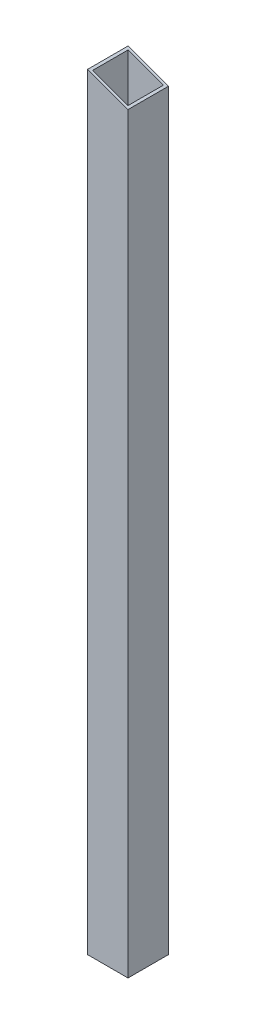
ISO-10303-21;
HEADER;
FILE_DESCRIPTION(('STEP AP214'),'2;1');
FILE_NAME('part.step','',(''),(''),'','','');
FILE_SCHEMA(('AUTOMOTIVE_DESIGN { 1 0 10303 214 1 1 1 1 }'));
ENDSEC;
DATA;
#1=APPLICATION_CONTEXT('core data for automotive mechanical design processes');
#2=APPLICATION_PROTOCOL_DEFINITION('international standard','automotive_design',2000,#1);
#3=PRODUCT_CONTEXT('',#1,'mechanical');
#4=PRODUCT('Part','Part','',(#3));
#5=PRODUCT_RELATED_PRODUCT_CATEGORY('part','',(#4));
#6=PRODUCT_DEFINITION_FORMATION('','',#4);
#7=PRODUCT_DEFINITION_CONTEXT('part definition',#1,'design');
#8=PRODUCT_DEFINITION('design','',#6,#7);
#9=PRODUCT_DEFINITION_SHAPE('','',#8);
#10=(LENGTH_UNIT() NAMED_UNIT(*) SI_UNIT(.MILLI.,.METRE.));
#11=(NAMED_UNIT(*) PLANE_ANGLE_UNIT() SI_UNIT($,.RADIAN.));
#12=(NAMED_UNIT(*) SI_UNIT($,.STERADIAN.) SOLID_ANGLE_UNIT());
#13=UNCERTAINTY_MEASURE_WITH_UNIT(LENGTH_MEASURE(1.E-05),#10,'distance_accuracy_value','');
#14=(GEOMETRIC_REPRESENTATION_CONTEXT(3) GLOBAL_UNCERTAINTY_ASSIGNED_CONTEXT((#13)) GLOBAL_UNIT_ASSIGNED_CONTEXT((#10,
#11,#12)) REPRESENTATION_CONTEXT('',''));
#15=CARTESIAN_POINT('',(0.,0.,0.));
#16=DIRECTION('',(0.,0.,1.));
#17=DIRECTION('',(1.,0.,0.));
#18=AXIS2_PLACEMENT_3D('',#15,#16,#17);
#19=CARTESIAN_POINT('',(0.,0.,0.));
#20=DIRECTION('',(0.,-1.,0.));
#21=DIRECTION('',(0.,0.,-1.));
#22=AXIS2_PLACEMENT_3D('',#19,#20,#21);
#23=PLANE('',#22);
#24=DIRECTION('',(0.,0.,-1.));
#25=VECTOR('',#24,1.);
#26=CARTESIAN_POINT('',(12.7,0.,12.7));
#27=LINE('',#26,#25);
#28=CARTESIAN_POINT('',(12.7,0.,12.7));
#29=VERTEX_POINT('',#28);
#30=CARTESIAN_POINT('',(12.7,0.,-12.7));
#31=VERTEX_POINT('',#30);
#32=EDGE_CURVE('E132',#29,#31,#27,.T.);
#33=ORIENTED_EDGE('',*,*,#32,.F.);
#34=DIRECTION('',(1.,0.,0.));
#35=VECTOR('',#34,1.);
#36=CARTESIAN_POINT('',(-12.7,0.,12.7));
#37=LINE('',#36,#35);
#38=CARTESIAN_POINT('',(-12.7,0.,12.7));
#39=VERTEX_POINT('',#38);
#40=EDGE_CURVE('E122',#39,#29,#37,.T.);
#41=ORIENTED_EDGE('',*,*,#40,.F.);
#42=DIRECTION('',(0.,0.,1.));
#43=VECTOR('',#42,1.);
#44=CARTESIAN_POINT('',(-12.7,0.,12.7));
#45=LINE('',#44,#43);
#46=CARTESIAN_POINT('',(-12.7,0.,-12.7));
#47=VERTEX_POINT('',#46);
#48=EDGE_CURVE('E126',#47,#39,#45,.T.);
#49=ORIENTED_EDGE('',*,*,#48,.F.);
#50=DIRECTION('',(-1.,0.,0.));
#51=VECTOR('',#50,1.);
#52=CARTESIAN_POINT('',(-12.7,0.,-12.7));
#53=LINE('',#52,#51);
#54=EDGE_CURVE('E113',#31,#47,#53,.T.);
#55=ORIENTED_EDGE('',*,*,#54,.F.);
#56=EDGE_LOOP('',(#33,#41,#49,#55));
#57=FACE_BOUND('',#56,.T.);
#58=DIRECTION('',(1.,0.,0.));
#59=VECTOR('',#58,1.);
#60=CARTESIAN_POINT('',(-11.1125,0.,11.1125));
#61=LINE('',#60,#59);
#62=CARTESIAN_POINT('',(-11.1125,0.,11.1125));
#63=VERTEX_POINT('',#62);
#64=CARTESIAN_POINT('',(11.1125,0.,11.1125));
#65=VERTEX_POINT('',#64);
#66=EDGE_CURVE('E162',#63,#65,#61,.T.);
#67=ORIENTED_EDGE('',*,*,#66,.T.);
#68=DIRECTION('',(0.,0.,-1.));
#69=VECTOR('',#68,1.);
#70=CARTESIAN_POINT('',(11.1125,0.,11.1125));
#71=LINE('',#70,#69);
#72=CARTESIAN_POINT('',(11.1125,0.,-11.1125));
#73=VERTEX_POINT('',#72);
#74=EDGE_CURVE('E153',#65,#73,#71,.T.);
#75=ORIENTED_EDGE('',*,*,#74,.T.);
#76=DIRECTION('',(-1.,0.,0.));
#77=VECTOR('',#76,1.);
#78=CARTESIAN_POINT('',(-11.1125,0.,-11.1125));
#79=LINE('',#78,#77);
#80=CARTESIAN_POINT('',(-11.1125,0.,-11.1125));
#81=VERTEX_POINT('',#80);
#82=EDGE_CURVE('E156',#73,#81,#79,.T.);
#83=ORIENTED_EDGE('',*,*,#82,.T.);
#84=DIRECTION('',(0.,0.,1.));
#85=VECTOR('',#84,1.);
#86=CARTESIAN_POINT('',(-11.1125,0.,11.1125));
#87=LINE('',#86,#85);
#88=EDGE_CURVE('E159',#81,#63,#87,.T.);
#89=ORIENTED_EDGE('',*,*,#88,.T.);
#90=EDGE_LOOP('',(#67,#75,#83,#89));
#91=FACE_BOUND('',#90,.T.);
#92=ADVANCED_FACE('F33',(#57,#91),#23,.T.);
#93=CARTESIAN_POINT('',(12.7,482.6,12.7));
#94=DIRECTION('',(-1.,0.,0.));
#95=DIRECTION('',(0.,0.,1.));
#96=AXIS2_PLACEMENT_3D('',#93,#94,#95);
#97=PLANE('',#96);
#98=DIRECTION('',(0.,-1.,0.));
#99=VECTOR('',#98,1.);
#100=CARTESIAN_POINT('',(12.7,482.6,-12.7));
#101=LINE('',#100,#99);
#102=CARTESIAN_POINT('',(12.7,473.355156049639,-12.7));
#103=VERTEX_POINT('',#102);
#104=EDGE_CURVE('E41',#103,#31,#101,.T.);
#105=ORIENTED_EDGE('',*,*,#104,.F.);
#106=DIRECTION('',(0.,0.,1.));
#107=VECTOR('',#106,1.);
#108=CARTESIAN_POINT('',(12.7,473.355156049639,-12.7));
#109=LINE('',#108,#107);
#110=CARTESIAN_POINT('',(12.7,473.355156049639,12.7));
#111=VERTEX_POINT('',#110);
#112=EDGE_CURVE('E104',#103,#111,#109,.T.);
#113=ORIENTED_EDGE('',*,*,#112,.T.);
#114=DIRECTION('',(0.,-1.,0.));
#115=VECTOR('',#114,1.);
#116=CARTESIAN_POINT('',(12.7,482.6,12.7));
#117=LINE('',#116,#115);
#118=EDGE_CURVE('E121',#111,#29,#117,.T.);
#119=ORIENTED_EDGE('',*,*,#118,.T.);
#120=ORIENTED_EDGE('',*,*,#32,.T.);
#121=EDGE_LOOP('',(#105,#113,#119,#120));
#122=FACE_BOUND('',#121,.T.);
#123=ADVANCED_FACE('F35',(#122),#97,.F.);
#124=CARTESIAN_POINT('',(-12.7,482.6,-12.7));
#125=DIRECTION('',(0.,0.,1.));
#126=DIRECTION('',(1.,0.,0.));
#127=AXIS2_PLACEMENT_3D('',#124,#125,#126);
#128=PLANE('',#127);
#129=DIRECTION('',(0.,-1.,0.));
#130=VECTOR('',#129,1.);
#131=CARTESIAN_POINT('',(-12.7,482.6,-12.7));
#132=LINE('',#131,#130);
#133=CARTESIAN_POINT('',(-12.7,482.6,-12.7));
#134=VERTEX_POINT('',#133);
#135=EDGE_CURVE('E110',#134,#47,#132,.T.);
#136=ORIENTED_EDGE('',*,*,#135,.F.);
#137=DIRECTION('',(0.93969262078591,-0.342020143325664,0.));
#138=VECTOR('',#137,1.);
#139=CARTESIAN_POINT('',(-12.7,482.6,-12.7));
#140=LINE('',#139,#138);
#141=EDGE_CURVE('E97',#134,#103,#140,.T.);
#142=ORIENTED_EDGE('',*,*,#141,.T.);
#143=ORIENTED_EDGE('',*,*,#104,.T.);
#144=ORIENTED_EDGE('',*,*,#54,.T.);
#145=EDGE_LOOP('',(#136,#142,#143,#144));
#146=FACE_BOUND('',#145,.T.);
#147=ADVANCED_FACE('F111',(#146),#128,.F.);
#148=CARTESIAN_POINT('',(-12.7,482.6,12.7));
#149=DIRECTION('',(1.,0.,0.));
#150=DIRECTION('',(0.,0.,-1.));
#151=AXIS2_PLACEMENT_3D('',#148,#149,#150);
#152=PLANE('',#151);
#153=ORIENTED_EDGE('',*,*,#48,.T.);
#154=DIRECTION('',(0.,-1.,0.));
#155=VECTOR('',#154,1.);
#156=CARTESIAN_POINT('',(-12.7,482.6,12.7));
#157=LINE('',#156,#155);
#158=CARTESIAN_POINT('',(-12.7,482.6,12.7));
#159=VERTEX_POINT('',#158);
#160=EDGE_CURVE('E116',#159,#39,#157,.T.);
#161=ORIENTED_EDGE('',*,*,#160,.F.);
#162=DIRECTION('',(0.,0.,1.));
#163=VECTOR('',#162,1.);
#164=CARTESIAN_POINT('',(-12.7,482.6,12.7));
#165=LINE('',#164,#163);
#166=EDGE_CURVE('E101',#134,#159,#165,.T.);
#167=ORIENTED_EDGE('',*,*,#166,.F.);
#168=ORIENTED_EDGE('',*,*,#135,.T.);
#169=EDGE_LOOP('',(#153,#161,#167,#168));
#170=FACE_BOUND('',#169,.T.);
#171=ADVANCED_FACE('F119',(#170),#152,.F.);
#172=CARTESIAN_POINT('',(-12.7,482.6,12.7));
#173=DIRECTION('',(0.,0.,-1.));
#174=DIRECTION('',(-1.,0.,0.));
#175=AXIS2_PLACEMENT_3D('',#172,#173,#174);
#176=PLANE('',#175);
#177=ORIENTED_EDGE('',*,*,#118,.F.);
#178=DIRECTION('',(0.93969262078591,-0.342020143325664,0.));
#179=VECTOR('',#178,1.);
#180=CARTESIAN_POINT('',(-12.7,482.6,12.7));
#181=LINE('',#180,#179);
#182=EDGE_CURVE('E107',#159,#111,#181,.T.);
#183=ORIENTED_EDGE('',*,*,#182,.F.);
#184=ORIENTED_EDGE('',*,*,#160,.T.);
#185=ORIENTED_EDGE('',*,*,#40,.T.);
#186=EDGE_LOOP('',(#177,#183,#184,#185));
#187=FACE_BOUND('',#186,.T.);
#188=ADVANCED_FACE('F144',(#187),#176,.F.);
#189=CARTESIAN_POINT('',(11.1125,482.6,11.1125));
#190=DIRECTION('',(-1.,0.,0.));
#191=DIRECTION('',(0.,0.,1.));
#192=AXIS2_PLACEMENT_3D('',#189,#190,#191);
#193=PLANE('',#192);
#194=DIRECTION('',(0.,0.,1.));
#195=VECTOR('',#194,1.);
#196=CARTESIAN_POINT('',(11.1125,473.932958796536,11.1125));
#197=LINE('',#196,#195);
#198=CARTESIAN_POINT('',(11.1125,473.932958796536,-11.1125));
#199=VERTEX_POINT('',#198);
#200=CARTESIAN_POINT('',(11.1125,473.932958796536,11.1125));
#201=VERTEX_POINT('',#200);
#202=EDGE_CURVE('E47',#199,#201,#197,.T.);
#203=ORIENTED_EDGE('',*,*,#202,.F.);
#204=DIRECTION('',(0.,-1.,0.));
#205=VECTOR('',#204,1.);
#206=CARTESIAN_POINT('',(11.1125,482.6,-11.1125));
#207=LINE('',#206,#205);
#208=EDGE_CURVE('E130',#199,#73,#207,.T.);
#209=ORIENTED_EDGE('',*,*,#208,.T.);
#210=ORIENTED_EDGE('',*,*,#74,.F.);
#211=DIRECTION('',(0.,-1.,0.));
#212=VECTOR('',#211,1.);
#213=CARTESIAN_POINT('',(11.1125,482.6,11.1125));
#214=LINE('',#213,#212);
#215=EDGE_CURVE('E54',#201,#65,#214,.T.);
#216=ORIENTED_EDGE('',*,*,#215,.F.);
#217=EDGE_LOOP('',(#203,#209,#210,#216));
#218=FACE_BOUND('',#217,.T.);
#219=ADVANCED_FACE('F175',(#218),#193,.T.);
#220=CARTESIAN_POINT('',(-11.1125,482.6,-11.1125));
#221=DIRECTION('',(0.,0.,1.));
#222=DIRECTION('',(1.,0.,0.));
#223=AXIS2_PLACEMENT_3D('',#220,#221,#222);
#224=PLANE('',#223);
#225=DIRECTION('',(0.93969262078591,-0.342020143325664,0.));
#226=VECTOR('',#225,1.);
#227=CARTESIAN_POINT('',(-11.2982022232743,482.089787334811,-11.1125));
#228=LINE('',#227,#226);
#229=CARTESIAN_POINT('',(-11.1125,482.022197253102,-11.1125));
#230=VERTEX_POINT('',#229);
#231=EDGE_CURVE('E150',#230,#199,#228,.T.);
#232=ORIENTED_EDGE('',*,*,#231,.F.);
#233=DIRECTION('',(0.,-1.,0.));
#234=VECTOR('',#233,1.);
#235=CARTESIAN_POINT('',(-11.1125,482.6,-11.1125));
#236=LINE('',#235,#234);
#237=EDGE_CURVE('E167',#230,#81,#236,.T.);
#238=ORIENTED_EDGE('',*,*,#237,.T.);
#239=ORIENTED_EDGE('',*,*,#82,.F.);
#240=ORIENTED_EDGE('',*,*,#208,.F.);
#241=EDGE_LOOP('',(#232,#238,#239,#240));
#242=FACE_BOUND('',#241,.T.);
#243=ADVANCED_FACE('F176',(#242),#224,.T.);
#244=CARTESIAN_POINT('',(-11.1125,482.6,11.1125));
#245=DIRECTION('',(1.,0.,0.));
#246=DIRECTION('',(0.,0.,-1.));
#247=AXIS2_PLACEMENT_3D('',#244,#245,#246);
#248=PLANE('',#247);
#249=DIRECTION('',(0.,0.,-1.));
#250=VECTOR('',#249,1.);
#251=CARTESIAN_POINT('',(-11.1125,482.022197253102,11.1125));
#252=LINE('',#251,#250);
#253=CARTESIAN_POINT('',(-11.1125,482.022197253102,11.1125));
#254=VERTEX_POINT('',#253);
#255=EDGE_CURVE('E148',#254,#230,#252,.T.);
#256=ORIENTED_EDGE('',*,*,#255,.F.);
#257=DIRECTION('',(0.,-1.,0.));
#258=VECTOR('',#257,1.);
#259=CARTESIAN_POINT('',(-11.1125,482.6,11.1125));
#260=LINE('',#259,#258);
#261=EDGE_CURVE('E166',#254,#63,#260,.T.);
#262=ORIENTED_EDGE('',*,*,#261,.T.);
#263=ORIENTED_EDGE('',*,*,#88,.F.);
#264=ORIENTED_EDGE('',*,*,#237,.F.);
#265=EDGE_LOOP('',(#256,#262,#263,#264));
#266=FACE_BOUND('',#265,.T.);
#267=ADVANCED_FACE('F181',(#266),#248,.T.);
#268=CARTESIAN_POINT('',(-11.1125,482.6,11.1125));
#269=DIRECTION('',(0.,0.,-1.));
#270=DIRECTION('',(-1.,0.,0.));
#271=AXIS2_PLACEMENT_3D('',#268,#269,#270);
#272=PLANE('',#271);
#273=DIRECTION('',(-0.93969262078591,0.342020143325664,0.));
#274=VECTOR('',#273,1.);
#275=CARTESIAN_POINT('',(-11.2982022232743,482.089787334811,11.1125));
#276=LINE('',#275,#274);
#277=EDGE_CURVE('E11',#201,#254,#276,.T.);
#278=ORIENTED_EDGE('',*,*,#277,.F.);
#279=ORIENTED_EDGE('',*,*,#215,.T.);
#280=ORIENTED_EDGE('',*,*,#66,.F.);
#281=ORIENTED_EDGE('',*,*,#261,.F.);
#282=EDGE_LOOP('',(#278,#279,#280,#281));
#283=FACE_BOUND('',#282,.T.);
#284=ADVANCED_FACE('F178',(#283),#272,.T.);
#285=CARTESIAN_POINT('',(-12.7,482.6,-12.7));
#286=DIRECTION('',(-0.342020143325664,-0.93969262078591,0.));
#287=DIRECTION('',(0.93969262078591,-0.342020143325664,0.));
#288=AXIS2_PLACEMENT_3D('',#285,#286,#287);
#289=PLANE('',#288);
#290=ORIENTED_EDGE('',*,*,#202,.T.);
#291=ORIENTED_EDGE('',*,*,#277,.T.);
#292=ORIENTED_EDGE('',*,*,#255,.T.);
#293=ORIENTED_EDGE('',*,*,#231,.T.);
#294=EDGE_LOOP('',(#290,#291,#292,#293));
#295=FACE_BOUND('',#294,.T.);
#296=ORIENTED_EDGE('',*,*,#182,.T.);
#297=ORIENTED_EDGE('',*,*,#112,.F.);
#298=ORIENTED_EDGE('',*,*,#141,.F.);
#299=ORIENTED_EDGE('',*,*,#166,.T.);
#300=EDGE_LOOP('',(#296,#297,#298,#299));
#301=FACE_BOUND('',#300,.T.);
#302=ADVANCED_FACE('F99',(#295,#301),#289,.F.);
#303=CLOSED_SHELL('',(#92,#123,#147,#171,#188,#219,#243,#267,#284,#302));
#304=MANIFOLD_SOLID_BREP('B2',#303);
#305=ADVANCED_BREP_SHAPE_REPRESENTATION('',(#18,#304),#14);
#306=SHAPE_DEFINITION_REPRESENTATION(#9,#305);
ENDSEC;
END-ISO-10303-21;
